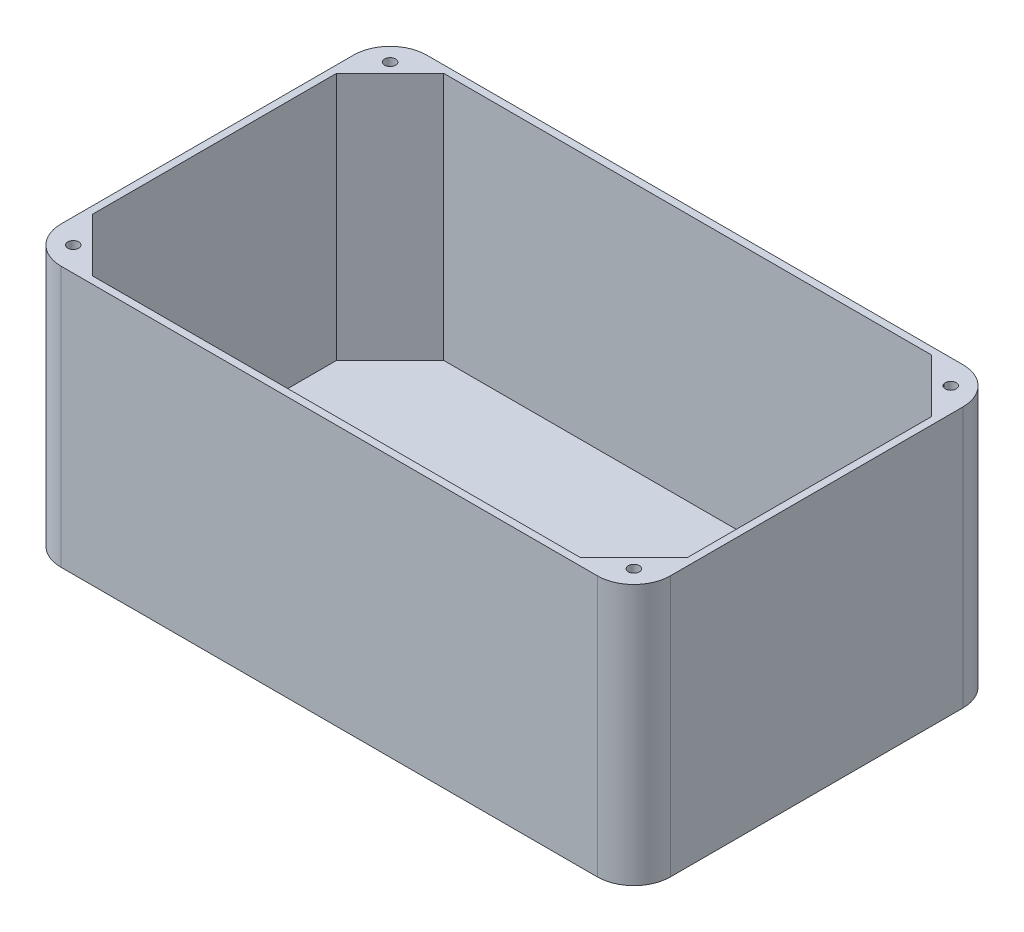
ISO-10303-21;
HEADER;
FILE_DESCRIPTION(('STEP AP214'),'2;1');
FILE_NAME('part.step','',(''),(''),'','','');
FILE_SCHEMA(('AUTOMOTIVE_DESIGN { 1 0 10303 214 1 1 1 1 }'));
ENDSEC;
DATA;
#1=APPLICATION_CONTEXT('core data for automotive mechanical design processes');
#2=APPLICATION_PROTOCOL_DEFINITION('international standard','automotive_design',2000,#1);
#3=PRODUCT_CONTEXT('',#1,'mechanical');
#4=PRODUCT('Part','Part','',(#3));
#5=PRODUCT_RELATED_PRODUCT_CATEGORY('part','',(#4));
#6=PRODUCT_DEFINITION_FORMATION('','',#4);
#7=PRODUCT_DEFINITION_CONTEXT('part definition',#1,'design');
#8=PRODUCT_DEFINITION('design','',#6,#7);
#9=PRODUCT_DEFINITION_SHAPE('','',#8);
#10=(LENGTH_UNIT() NAMED_UNIT(*) SI_UNIT(.MILLI.,.METRE.));
#11=(NAMED_UNIT(*) PLANE_ANGLE_UNIT() SI_UNIT($,.RADIAN.));
#12=(NAMED_UNIT(*) SI_UNIT($,.STERADIAN.) SOLID_ANGLE_UNIT());
#13=UNCERTAINTY_MEASURE_WITH_UNIT(LENGTH_MEASURE(1.E-05),#10,'distance_accuracy_value','');
#14=(GEOMETRIC_REPRESENTATION_CONTEXT(3) GLOBAL_UNCERTAINTY_ASSIGNED_CONTEXT((#13)) GLOBAL_UNIT_ASSIGNED_CONTEXT((#10,
#11,#12)) REPRESENTATION_CONTEXT('',''));
#15=CARTESIAN_POINT('',(0.,0.,0.));
#16=DIRECTION('',(0.,0.,1.));
#17=DIRECTION('',(1.,0.,0.));
#18=AXIS2_PLACEMENT_3D('',#15,#16,#17);
#19=CARTESIAN_POINT('',(-125.,110.,-72.));
#20=DIRECTION('',(0.,0.,1.));
#21=DIRECTION('',(1.,0.,0.));
#22=AXIS2_PLACEMENT_3D('',#19,#20,#21);
#23=PLANE('',#22);
#24=DIRECTION('',(-1.,0.,0.));
#25=VECTOR('',#24,1.);
#26=CARTESIAN_POINT('',(-125.,5.,-72.));
#27=LINE('',#26,#25);
#28=CARTESIAN_POINT('',(100.,5.,-72.));
#29=VERTEX_POINT('',#28);
#30=CARTESIAN_POINT('',(-100.,5.,-72.));
#31=VERTEX_POINT('',#30);
#32=EDGE_CURVE('E309',#29,#31,#27,.T.);
#33=ORIENTED_EDGE('',*,*,#32,.F.);
#34=DIRECTION('',(0.,1.,0.));
#35=VECTOR('',#34,1.);
#36=CARTESIAN_POINT('',(100.,110.,-72.));
#37=LINE('',#36,#35);
#38=CARTESIAN_POINT('',(100.,107.,-72.));
#39=VERTEX_POINT('',#38);
#40=EDGE_CURVE('E247',#29,#39,#37,.T.);
#41=ORIENTED_EDGE('',*,*,#40,.T.);
#42=DIRECTION('',(-1.,0.,0.));
#43=VECTOR('',#42,1.);
#44=CARTESIAN_POINT('',(0.,107.,-72.));
#45=LINE('',#44,#43);
#46=CARTESIAN_POINT('',(-100.,107.,-72.));
#47=VERTEX_POINT('',#46);
#48=EDGE_CURVE('E320',#39,#47,#45,.T.);
#49=ORIENTED_EDGE('',*,*,#48,.T.);
#50=DIRECTION('',(0.,1.,0.));
#51=VECTOR('',#50,1.);
#52=CARTESIAN_POINT('',(-100.,110.,-72.));
#53=LINE('',#52,#51);
#54=EDGE_CURVE('E279',#31,#47,#53,.T.);
#55=ORIENTED_EDGE('',*,*,#54,.F.);
#56=EDGE_LOOP('',(#33,#41,#49,#55));
#57=FACE_BOUND('',#56,.T.);
#58=ADVANCED_FACE('F74',(#57),#23,.T.);
#59=CARTESIAN_POINT('',(122.,110.,75.));
#60=DIRECTION('',(-1.,0.,0.));
#61=DIRECTION('',(0.,0.,1.));
#62=AXIS2_PLACEMENT_3D('',#59,#60,#61);
#63=PLANE('',#62);
#64=DIRECTION('',(0.,0.,-1.));
#65=VECTOR('',#64,1.);
#66=CARTESIAN_POINT('',(122.,107.,0.));
#67=LINE('',#66,#65);
#68=CARTESIAN_POINT('',(122.,107.,50.0000000000001));
#69=VERTEX_POINT('',#68);
#70=CARTESIAN_POINT('',(122.,107.,-50.0000000000001));
#71=VERTEX_POINT('',#70);
#72=EDGE_CURVE('E316',#69,#71,#67,.T.);
#73=ORIENTED_EDGE('',*,*,#72,.T.);
#74=DIRECTION('',(0.,-1.,0.));
#75=VECTOR('',#74,1.);
#76=CARTESIAN_POINT('',(122.,110.,-50.0000000000001));
#77=LINE('',#76,#75);
#78=CARTESIAN_POINT('',(122.,5.,-50.0000000000001));
#79=VERTEX_POINT('',#78);
#80=EDGE_CURVE('E243',#71,#79,#77,.T.);
#81=ORIENTED_EDGE('',*,*,#80,.T.);
#82=DIRECTION('',(0.,0.,-1.));
#83=VECTOR('',#82,1.);
#84=CARTESIAN_POINT('',(122.,5.,75.));
#85=LINE('',#84,#83);
#86=CARTESIAN_POINT('',(122.,5.,50.0000000000001));
#87=VERTEX_POINT('',#86);
#88=EDGE_CURVE('E312',#87,#79,#85,.T.);
#89=ORIENTED_EDGE('',*,*,#88,.F.);
#90=DIRECTION('',(0.,-1.,0.));
#91=VECTOR('',#90,1.);
#92=CARTESIAN_POINT('',(122.,110.,50.0000000000001));
#93=LINE('',#92,#91);
#94=EDGE_CURVE('E267',#69,#87,#93,.T.);
#95=ORIENTED_EDGE('',*,*,#94,.F.);
#96=EDGE_LOOP('',(#73,#81,#89,#95));
#97=FACE_BOUND('',#96,.T.);
#98=ADVANCED_FACE('F445',(#97),#63,.T.);
#99=CARTESIAN_POINT('',(0.,5.,0.));
#100=DIRECTION('',(0.,1.,0.));
#101=DIRECTION('',(0.,0.,1.));
#102=AXIS2_PLACEMENT_3D('',#99,#100,#101);
#103=PLANE('',#102);
#104=ORIENTED_EDGE('',*,*,#88,.T.);
#105=DIRECTION('',(-0.707106781186548,0.,-0.707106781186547));
#106=VECTOR('',#105,1.);
#107=CARTESIAN_POINT('',(86.,5.,-86.));
#108=LINE('',#107,#106);
#109=EDGE_CURVE('E356',#79,#29,#108,.T.);
#110=ORIENTED_EDGE('',*,*,#109,.T.);
#111=ORIENTED_EDGE('',*,*,#32,.T.);
#112=DIRECTION('',(0.707106781186547,0.,-0.707106781186548));
#113=VECTOR('',#112,1.);
#114=CARTESIAN_POINT('',(-86.0000000000001,5.,-86.));
#115=LINE('',#114,#113);
#116=CARTESIAN_POINT('',(-122.,5.,-50.));
#117=VERTEX_POINT('',#116);
#118=EDGE_CURVE('E344',#117,#31,#115,.T.);
#119=ORIENTED_EDGE('',*,*,#118,.F.);
#120=DIRECTION('',(0.,0.,1.));
#121=VECTOR('',#120,1.);
#122=CARTESIAN_POINT('',(-122.,5.,75.));
#123=LINE('',#122,#121);
#124=CARTESIAN_POINT('',(-122.,5.,50.));
#125=VERTEX_POINT('',#124);
#126=EDGE_CURVE('E306',#117,#125,#123,.T.);
#127=ORIENTED_EDGE('',*,*,#126,.T.);
#128=DIRECTION('',(-0.707106781186542,0.,-0.707106781186553));
#129=VECTOR('',#128,1.);
#130=CARTESIAN_POINT('',(-86.000000000001,5.,85.9999999999996));
#131=LINE('',#130,#129);
#132=CARTESIAN_POINT('',(-100.,5.,72.));
#133=VERTEX_POINT('',#132);
#134=EDGE_CURVE('E352',#133,#125,#131,.T.);
#135=ORIENTED_EDGE('',*,*,#134,.F.);
#136=DIRECTION('',(1.,0.,0.));
#137=VECTOR('',#136,1.);
#138=CARTESIAN_POINT('',(-125.,5.,72.));
#139=LINE('',#138,#137);
#140=CARTESIAN_POINT('',(100.,5.,72.));
#141=VERTEX_POINT('',#140);
#142=EDGE_CURVE('E303',#133,#141,#139,.T.);
#143=ORIENTED_EDGE('',*,*,#142,.T.);
#144=DIRECTION('',(-0.707106781186548,0.,0.707106781186547));
#145=VECTOR('',#144,1.);
#146=CARTESIAN_POINT('',(86.,5.,86.));
#147=LINE('',#146,#145);
#148=EDGE_CURVE('E348',#87,#141,#147,.T.);
#149=ORIENTED_EDGE('',*,*,#148,.F.);
#150=EDGE_LOOP('',(#104,#110,#111,#119,#127,#135,#143,#149));
#151=FACE_BOUND('',#150,.T.);
#152=ADVANCED_FACE('F451',(#151),#103,.T.);
#153=CARTESIAN_POINT('',(0.,0.,0.));
#154=DIRECTION('',(0.,-1.,0.));
#155=DIRECTION('',(0.,0.,-1.));
#156=AXIS2_PLACEMENT_3D('',#153,#154,#155);
#157=PLANE('',#156);
#158=DIRECTION('',(-1.,0.,0.));
#159=VECTOR('',#158,1.);
#160=CARTESIAN_POINT('',(-125.,0.,-75.));
#161=LINE('',#160,#159);
#162=CARTESIAN_POINT('',(110.,0.,-75.));
#163=VERTEX_POINT('',#162);
#164=CARTESIAN_POINT('',(-110.,0.,-75.));
#165=VERTEX_POINT('',#164);
#166=EDGE_CURVE('E333',#163,#165,#161,.T.);
#167=ORIENTED_EDGE('',*,*,#166,.F.);
#168=CARTESIAN_POINT('',(110.,0.,-60.));
#169=DIRECTION('',(0.,-1.,0.));
#170=DIRECTION('',(0.,0.,-1.));
#171=AXIS2_PLACEMENT_3D('',#168,#169,#170);
#172=CIRCLE('',#171,15.);
#173=CARTESIAN_POINT('',(125.,0.,-60.));
#174=VERTEX_POINT('',#173);
#175=EDGE_CURVE('E394',#163,#174,#172,.T.);
#176=ORIENTED_EDGE('',*,*,#175,.T.);
#177=DIRECTION('',(0.,0.,-1.));
#178=VECTOR('',#177,1.);
#179=CARTESIAN_POINT('',(125.,0.,75.));
#180=LINE('',#179,#178);
#181=CARTESIAN_POINT('',(125.,0.,60.));
#182=VERTEX_POINT('',#181);
#183=EDGE_CURVE('E329',#182,#174,#180,.T.);
#184=ORIENTED_EDGE('',*,*,#183,.F.);
#185=CARTESIAN_POINT('',(110.,0.,60.));
#186=DIRECTION('',(0.,-1.,0.));
#187=DIRECTION('',(0.,0.,-1.));
#188=AXIS2_PLACEMENT_3D('',#185,#186,#187);
#189=CIRCLE('',#188,15.);
#190=CARTESIAN_POINT('',(110.,0.,75.));
#191=VERTEX_POINT('',#190);
#192=EDGE_CURVE('E391',#182,#191,#189,.T.);
#193=ORIENTED_EDGE('',*,*,#192,.T.);
#194=DIRECTION('',(1.,0.,0.));
#195=VECTOR('',#194,1.);
#196=CARTESIAN_POINT('',(-125.,0.,75.));
#197=LINE('',#196,#195);
#198=CARTESIAN_POINT('',(-110.,0.,75.));
#199=VERTEX_POINT('',#198);
#200=EDGE_CURVE('E340',#199,#191,#197,.T.);
#201=ORIENTED_EDGE('',*,*,#200,.F.);
#202=CARTESIAN_POINT('',(-110.,0.,60.));
#203=DIRECTION('',(0.,-1.,0.));
#204=DIRECTION('',(0.,0.,-1.));
#205=AXIS2_PLACEMENT_3D('',#202,#203,#204);
#206=CIRCLE('',#205,15.);
#207=CARTESIAN_POINT('',(-125.,0.,60.));
#208=VERTEX_POINT('',#207);
#209=EDGE_CURVE('E90',#199,#208,#206,.T.);
#210=ORIENTED_EDGE('',*,*,#209,.T.);
#211=DIRECTION('',(0.,0.,1.));
#212=VECTOR('',#211,1.);
#213=CARTESIAN_POINT('',(-125.,0.,75.));
#214=LINE('',#213,#212);
#215=CARTESIAN_POINT('',(-125.,0.,-60.));
#216=VERTEX_POINT('',#215);
#217=EDGE_CURVE('E337',#216,#208,#214,.T.);
#218=ORIENTED_EDGE('',*,*,#217,.F.);
#219=CARTESIAN_POINT('',(-110.,0.,-60.));
#220=DIRECTION('',(0.,-1.,0.));
#221=DIRECTION('',(0.,0.,-1.));
#222=AXIS2_PLACEMENT_3D('',#219,#220,#221);
#223=CIRCLE('',#222,15.);
#224=EDGE_CURVE('E386',#216,#165,#223,.T.);
#225=ORIENTED_EDGE('',*,*,#224,.T.);
#226=EDGE_LOOP('',(#167,#176,#184,#193,#201,#210,#218,#225));
#227=FACE_BOUND('',#226,.T.);
#228=ADVANCED_FACE('F420',(#227),#157,.T.);
#229=CARTESIAN_POINT('',(125.,110.,75.));
#230=DIRECTION('',(-1.,0.,0.));
#231=DIRECTION('',(0.,0.,1.));
#232=AXIS2_PLACEMENT_3D('',#229,#230,#231);
#233=PLANE('',#232);
#234=ORIENTED_EDGE('',*,*,#183,.T.);
#235=DIRECTION('',(0.,1.,0.));
#236=VECTOR('',#235,1.);
#237=CARTESIAN_POINT('',(125.,110.,-60.));
#238=LINE('',#237,#236);
#239=CARTESIAN_POINT('',(125.,107.,-60.));
#240=VERTEX_POINT('',#239);
#241=EDGE_CURVE('E363',#174,#240,#238,.T.);
#242=ORIENTED_EDGE('',*,*,#241,.T.);
#243=DIRECTION('',(0.,0.,-1.));
#244=VECTOR('',#243,1.);
#245=CARTESIAN_POINT('',(125.,107.,75.));
#246=LINE('',#245,#244);
#247=CARTESIAN_POINT('',(125.,107.,60.));
#248=VERTEX_POINT('',#247);
#249=EDGE_CURVE('E287',#248,#240,#246,.T.);
#250=ORIENTED_EDGE('',*,*,#249,.F.);
#251=DIRECTION('',(0.,1.,0.));
#252=VECTOR('',#251,1.);
#253=CARTESIAN_POINT('',(125.,110.,60.));
#254=LINE('',#253,#252);
#255=EDGE_CURVE('E360',#248,#182,#254,.F.);
#256=ORIENTED_EDGE('',*,*,#255,.T.);
#257=EDGE_LOOP('',(#234,#242,#250,#256));
#258=FACE_BOUND('',#257,.T.);
#259=ADVANCED_FACE('F432',(#258),#233,.F.);
#260=CARTESIAN_POINT('',(-125.,110.,-75.));
#261=DIRECTION('',(0.,0.,1.));
#262=DIRECTION('',(1.,0.,0.));
#263=AXIS2_PLACEMENT_3D('',#260,#261,#262);
#264=PLANE('',#263);
#265=DIRECTION('',(-1.,0.,0.));
#266=VECTOR('',#265,1.);
#267=CARTESIAN_POINT('',(-125.,107.,-75.));
#268=LINE('',#267,#266);
#269=CARTESIAN_POINT('',(110.,107.,-75.));
#270=VERTEX_POINT('',#269);
#271=CARTESIAN_POINT('',(-110.,107.,-75.));
#272=VERTEX_POINT('',#271);
#273=EDGE_CURVE('E291',#270,#272,#268,.T.);
#274=ORIENTED_EDGE('',*,*,#273,.F.);
#275=DIRECTION('',(0.,1.,0.));
#276=VECTOR('',#275,1.);
#277=CARTESIAN_POINT('',(110.,110.,-75.));
#278=LINE('',#277,#276);
#279=EDGE_CURVE('E383',#270,#163,#278,.F.);
#280=ORIENTED_EDGE('',*,*,#279,.T.);
#281=ORIENTED_EDGE('',*,*,#166,.T.);
#282=DIRECTION('',(0.,1.,0.));
#283=VECTOR('',#282,1.);
#284=CARTESIAN_POINT('',(-110.,110.,-75.));
#285=LINE('',#284,#283);
#286=EDGE_CURVE('E379',#165,#272,#285,.T.);
#287=ORIENTED_EDGE('',*,*,#286,.T.);
#288=EDGE_LOOP('',(#274,#280,#281,#287));
#289=FACE_BOUND('',#288,.T.);
#290=ADVANCED_FACE('F425',(#289),#264,.F.);
#291=CARTESIAN_POINT('',(-125.,110.,75.));
#292=DIRECTION('',(1.,0.,0.));
#293=DIRECTION('',(0.,0.,-1.));
#294=AXIS2_PLACEMENT_3D('',#291,#292,#293);
#295=PLANE('',#294);
#296=ORIENTED_EDGE('',*,*,#217,.T.);
#297=DIRECTION('',(0.,1.,0.));
#298=VECTOR('',#297,1.);
#299=CARTESIAN_POINT('',(-125.,110.,60.));
#300=LINE('',#299,#298);
#301=CARTESIAN_POINT('',(-125.,107.,60.));
#302=VERTEX_POINT('',#301);
#303=EDGE_CURVE('E12',#208,#302,#300,.T.);
#304=ORIENTED_EDGE('',*,*,#303,.T.);
#305=DIRECTION('',(0.,0.,1.));
#306=VECTOR('',#305,1.);
#307=CARTESIAN_POINT('',(-125.,107.,75.));
#308=LINE('',#307,#306);
#309=CARTESIAN_POINT('',(-125.,107.,-60.));
#310=VERTEX_POINT('',#309);
#311=EDGE_CURVE('E295',#310,#302,#308,.T.);
#312=ORIENTED_EDGE('',*,*,#311,.F.);
#313=DIRECTION('',(0.,1.,0.));
#314=VECTOR('',#313,1.);
#315=CARTESIAN_POINT('',(-125.,110.,-60.));
#316=LINE('',#315,#314);
#317=EDGE_CURVE('E83',#310,#216,#316,.F.);
#318=ORIENTED_EDGE('',*,*,#317,.T.);
#319=EDGE_LOOP('',(#296,#304,#312,#318));
#320=FACE_BOUND('',#319,.T.);
#321=ADVANCED_FACE('F417',(#320),#295,.F.);
#322=CARTESIAN_POINT('',(-125.,110.,75.));
#323=DIRECTION('',(0.,0.,-1.));
#324=DIRECTION('',(-1.,0.,0.));
#325=AXIS2_PLACEMENT_3D('',#322,#323,#324);
#326=PLANE('',#325);
#327=ORIENTED_EDGE('',*,*,#200,.T.);
#328=DIRECTION('',(0.,1.,0.));
#329=VECTOR('',#328,1.);
#330=CARTESIAN_POINT('',(110.,110.,75.));
#331=LINE('',#330,#329);
#332=CARTESIAN_POINT('',(110.,107.,75.));
#333=VERTEX_POINT('',#332);
#334=EDGE_CURVE('E400',#191,#333,#331,.T.);
#335=ORIENTED_EDGE('',*,*,#334,.T.);
#336=DIRECTION('',(1.,0.,0.));
#337=VECTOR('',#336,1.);
#338=CARTESIAN_POINT('',(-125.,107.,75.));
#339=LINE('',#338,#337);
#340=CARTESIAN_POINT('',(-110.,107.,75.));
#341=VERTEX_POINT('',#340);
#342=EDGE_CURVE('E299',#341,#333,#339,.T.);
#343=ORIENTED_EDGE('',*,*,#342,.F.);
#344=DIRECTION('',(0.,1.,0.));
#345=VECTOR('',#344,1.);
#346=CARTESIAN_POINT('',(-110.,110.,75.));
#347=LINE('',#346,#345);
#348=EDGE_CURVE('E397',#341,#199,#347,.F.);
#349=ORIENTED_EDGE('',*,*,#348,.T.);
#350=EDGE_LOOP('',(#327,#335,#343,#349));
#351=FACE_BOUND('',#350,.T.);
#352=ADVANCED_FACE('F407',(#351),#326,.F.);
#353=CARTESIAN_POINT('',(0.,107.,0.));
#354=DIRECTION('',(0.,-1.,0.));
#355=DIRECTION('',(0.,0.,-1.));
#356=AXIS2_PLACEMENT_3D('',#353,#354,#355);
#357=PLANE('',#356);
#358=CARTESIAN_POINT('',(-115.,107.,-65.));
#359=DIRECTION('',(0.,1.,0.));
#360=DIRECTION('',(0.,0.,1.));
#361=AXIS2_PLACEMENT_3D('',#358,#359,#360);
#362=CIRCLE('',#361,2.25);
#363=CARTESIAN_POINT('',(-115.,107.,-62.75));
#364=VERTEX_POINT('',#363);
#365=EDGE_CURVE('E211',#364,#364,#362,.T.);
#366=ORIENTED_EDGE('',*,*,#365,.F.);
#367=EDGE_LOOP('',(#366));
#368=FACE_BOUND('',#367,.T.);
#369=CARTESIAN_POINT('',(115.,107.,-65.));
#370=DIRECTION('',(0.,1.,0.));
#371=DIRECTION('',(0.,0.,1.));
#372=AXIS2_PLACEMENT_3D('',#369,#370,#371);
#373=CIRCLE('',#372,2.25);
#374=CARTESIAN_POINT('',(115.,107.,-62.75));
#375=VERTEX_POINT('',#374);
#376=EDGE_CURVE('E210',#375,#375,#373,.T.);
#377=ORIENTED_EDGE('',*,*,#376,.F.);
#378=EDGE_LOOP('',(#377));
#379=FACE_BOUND('',#378,.T.);
#380=CARTESIAN_POINT('',(115.,107.,65.));
#381=DIRECTION('',(0.,1.,0.));
#382=DIRECTION('',(0.,0.,1.));
#383=AXIS2_PLACEMENT_3D('',#380,#381,#382);
#384=CIRCLE('',#383,2.25);
#385=CARTESIAN_POINT('',(115.,107.,67.25));
#386=VERTEX_POINT('',#385);
#387=EDGE_CURVE('E224',#386,#386,#384,.T.);
#388=ORIENTED_EDGE('',*,*,#387,.F.);
#389=EDGE_LOOP('',(#388));
#390=FACE_BOUND('',#389,.T.);
#391=CARTESIAN_POINT('',(-115.,107.,65.));
#392=DIRECTION('',(0.,1.,0.));
#393=DIRECTION('',(0.,0.,1.));
#394=AXIS2_PLACEMENT_3D('',#391,#392,#393);
#395=CIRCLE('',#394,2.25);
#396=CARTESIAN_POINT('',(-115.,107.,67.25));
#397=VERTEX_POINT('',#396);
#398=EDGE_CURVE('E232',#397,#397,#395,.T.);
#399=ORIENTED_EDGE('',*,*,#398,.F.);
#400=EDGE_LOOP('',(#399));
#401=FACE_BOUND('',#400,.T.);
#402=ORIENTED_EDGE('',*,*,#48,.F.);
#403=DIRECTION('',(-0.707106781186548,0.,-0.707106781186547));
#404=VECTOR('',#403,1.);
#405=CARTESIAN_POINT('',(122.,107.,-50.));
#406=LINE('',#405,#404);
#407=EDGE_CURVE('E240',#71,#39,#406,.T.);
#408=ORIENTED_EDGE('',*,*,#407,.F.);
#409=ORIENTED_EDGE('',*,*,#72,.F.);
#410=DIRECTION('',(-0.707106781186548,0.,0.707106781186547));
#411=VECTOR('',#410,1.);
#412=CARTESIAN_POINT('',(86.,107.,86.));
#413=LINE('',#412,#411);
#414=CARTESIAN_POINT('',(100.,107.,72.));
#415=VERTEX_POINT('',#414);
#416=EDGE_CURVE('E263',#69,#415,#413,.T.);
#417=ORIENTED_EDGE('',*,*,#416,.T.);
#418=DIRECTION('',(1.,0.,0.));
#419=VECTOR('',#418,1.);
#420=CARTESIAN_POINT('',(0.,107.,72.));
#421=LINE('',#420,#419);
#422=CARTESIAN_POINT('',(-100.,107.,72.));
#423=VERTEX_POINT('',#422);
#424=EDGE_CURVE('E326',#423,#415,#421,.T.);
#425=ORIENTED_EDGE('',*,*,#424,.F.);
#426=DIRECTION('',(-0.707106781186542,0.,-0.707106781186553));
#427=VECTOR('',#426,1.);
#428=CARTESIAN_POINT('',(-122.,107.,50.));
#429=LINE('',#428,#427);
#430=CARTESIAN_POINT('',(-122.,107.,50.));
#431=VERTEX_POINT('',#430);
#432=EDGE_CURVE('E251',#423,#431,#429,.T.);
#433=ORIENTED_EDGE('',*,*,#432,.T.);
#434=DIRECTION('',(0.,0.,1.));
#435=VECTOR('',#434,1.);
#436=CARTESIAN_POINT('',(-122.,107.,0.));
#437=LINE('',#436,#435);
#438=CARTESIAN_POINT('',(-122.,107.,-50.));
#439=VERTEX_POINT('',#438);
#440=EDGE_CURVE('E323',#439,#431,#437,.T.);
#441=ORIENTED_EDGE('',*,*,#440,.F.);
#442=DIRECTION('',(0.707106781186547,0.,-0.707106781186548));
#443=VECTOR('',#442,1.);
#444=CARTESIAN_POINT('',(-86.,107.,-86.));
#445=LINE('',#444,#443);
#446=EDGE_CURVE('E275',#439,#47,#445,.T.);
#447=ORIENTED_EDGE('',*,*,#446,.T.);
#448=EDGE_LOOP('',(#402,#408,#409,#417,#425,#433,#441,#447));
#449=FACE_BOUND('',#448,.T.);
#450=ORIENTED_EDGE('',*,*,#249,.T.);
#451=CARTESIAN_POINT('',(110.,107.,-60.));
#452=DIRECTION('',(0.,-1.,0.));
#453=DIRECTION('',(0.,0.,-1.));
#454=AXIS2_PLACEMENT_3D('',#451,#452,#453);
#455=CIRCLE('',#454,15.);
#456=EDGE_CURVE('E376',#240,#270,#455,.F.);
#457=ORIENTED_EDGE('',*,*,#456,.T.);
#458=ORIENTED_EDGE('',*,*,#273,.T.);
#459=CARTESIAN_POINT('',(-110.,107.,-60.));
#460=DIRECTION('',(0.,-1.,0.));
#461=DIRECTION('',(0.,0.,-1.));
#462=AXIS2_PLACEMENT_3D('',#459,#460,#461);
#463=CIRCLE('',#462,15.);
#464=EDGE_CURVE('E367',#272,#310,#463,.F.);
#465=ORIENTED_EDGE('',*,*,#464,.T.);
#466=ORIENTED_EDGE('',*,*,#311,.T.);
#467=CARTESIAN_POINT('',(-110.,107.,60.));
#468=DIRECTION('',(0.,-1.,0.));
#469=DIRECTION('',(0.,0.,-1.));
#470=AXIS2_PLACEMENT_3D('',#467,#468,#469);
#471=CIRCLE('',#470,15.);
#472=EDGE_CURVE('E370',#302,#341,#471,.F.);
#473=ORIENTED_EDGE('',*,*,#472,.T.);
#474=ORIENTED_EDGE('',*,*,#342,.T.);
#475=CARTESIAN_POINT('',(110.,107.,60.));
#476=DIRECTION('',(0.,-1.,0.));
#477=DIRECTION('',(0.,0.,-1.));
#478=AXIS2_PLACEMENT_3D('',#475,#476,#477);
#479=CIRCLE('',#478,15.);
#480=EDGE_CURVE('E373',#333,#248,#479,.F.);
#481=ORIENTED_EDGE('',*,*,#480,.T.);
#482=EDGE_LOOP('',(#450,#457,#458,#465,#466,#473,#474,#481));
#483=FACE_BOUND('',#482,.T.);
#484=ADVANCED_FACE('F412',(#368,#379,#390,#401,#449,#483),#357,.F.);
#485=CARTESIAN_POINT('',(-125.,110.,72.));
#486=DIRECTION('',(0.,0.,-1.));
#487=DIRECTION('',(-1.,0.,0.));
#488=AXIS2_PLACEMENT_3D('',#485,#486,#487);
#489=PLANE('',#488);
#490=DIRECTION('',(0.,-1.,0.));
#491=VECTOR('',#490,1.);
#492=CARTESIAN_POINT('',(-100.,110.,72.));
#493=LINE('',#492,#491);
#494=EDGE_CURVE('E259',#423,#133,#493,.T.);
#495=ORIENTED_EDGE('',*,*,#494,.F.);
#496=ORIENTED_EDGE('',*,*,#424,.T.);
#497=DIRECTION('',(0.,1.,0.));
#498=VECTOR('',#497,1.);
#499=CARTESIAN_POINT('',(100.,110.,72.));
#500=LINE('',#499,#498);
#501=EDGE_CURVE('E271',#141,#415,#500,.T.);
#502=ORIENTED_EDGE('',*,*,#501,.F.);
#503=ORIENTED_EDGE('',*,*,#142,.F.);
#504=EDGE_LOOP('',(#495,#496,#502,#503));
#505=FACE_BOUND('',#504,.T.);
#506=ADVANCED_FACE('F461',(#505),#489,.T.);
#507=CARTESIAN_POINT('',(-122.,110.,75.));
#508=DIRECTION('',(1.,0.,0.));
#509=DIRECTION('',(0.,0.,-1.));
#510=AXIS2_PLACEMENT_3D('',#507,#508,#509);
#511=PLANE('',#510);
#512=DIRECTION('',(0.,1.,0.));
#513=VECTOR('',#512,1.);
#514=CARTESIAN_POINT('',(-122.,110.,50.));
#515=LINE('',#514,#513);
#516=EDGE_CURVE('E255',#125,#431,#515,.T.);
#517=ORIENTED_EDGE('',*,*,#516,.F.);
#518=ORIENTED_EDGE('',*,*,#126,.F.);
#519=DIRECTION('',(0.,-1.,0.));
#520=VECTOR('',#519,1.);
#521=CARTESIAN_POINT('',(-122.,110.,-50.));
#522=LINE('',#521,#520);
#523=EDGE_CURVE('E283',#439,#117,#522,.T.);
#524=ORIENTED_EDGE('',*,*,#523,.F.);
#525=ORIENTED_EDGE('',*,*,#440,.T.);
#526=EDGE_LOOP('',(#517,#518,#524,#525));
#527=FACE_BOUND('',#526,.T.);
#528=ADVANCED_FACE('F457',(#527),#511,.T.);
#529=CARTESIAN_POINT('',(-86.,-39.5979797464466,-86.));
#530=DIRECTION('',(0.707106781186548,0.,0.707106781186547));
#531=DIRECTION('',(0.707106781186547,0.,-0.707106781186548));
#532=AXIS2_PLACEMENT_3D('',#529,#530,#531);
#533=PLANE('',#532);
#534=ORIENTED_EDGE('',*,*,#446,.F.);
#535=ORIENTED_EDGE('',*,*,#523,.T.);
#536=ORIENTED_EDGE('',*,*,#118,.T.);
#537=ORIENTED_EDGE('',*,*,#54,.T.);
#538=EDGE_LOOP('',(#534,#535,#536,#537));
#539=FACE_BOUND('',#538,.T.);
#540=ADVANCED_FACE('F460',(#539),#533,.T.);
#541=CARTESIAN_POINT('',(86.,-39.5979797464466,86.));
#542=DIRECTION('',(-0.707106781186547,0.,-0.707106781186548));
#543=DIRECTION('',(-0.707106781186548,0.,0.707106781186547));
#544=AXIS2_PLACEMENT_3D('',#541,#542,#543);
#545=PLANE('',#544);
#546=ORIENTED_EDGE('',*,*,#148,.T.);
#547=ORIENTED_EDGE('',*,*,#501,.T.);
#548=ORIENTED_EDGE('',*,*,#416,.F.);
#549=ORIENTED_EDGE('',*,*,#94,.T.);
#550=EDGE_LOOP('',(#546,#547,#548,#549));
#551=FACE_BOUND('',#550,.T.);
#552=ADVANCED_FACE('F611',(#551),#545,.T.);
#553=CARTESIAN_POINT('',(-122.,-39.5979797464466,50.));
#554=DIRECTION('',(0.707106781186553,0.,-0.707106781186542));
#555=DIRECTION('',(-0.707106781186542,0.,-0.707106781186553));
#556=AXIS2_PLACEMENT_3D('',#553,#554,#555);
#557=PLANE('',#556);
#558=ORIENTED_EDGE('',*,*,#432,.F.);
#559=ORIENTED_EDGE('',*,*,#494,.T.);
#560=ORIENTED_EDGE('',*,*,#134,.T.);
#561=ORIENTED_EDGE('',*,*,#516,.T.);
#562=EDGE_LOOP('',(#558,#559,#560,#561));
#563=FACE_BOUND('',#562,.T.);
#564=ADVANCED_FACE('F607',(#563),#557,.T.);
#565=CARTESIAN_POINT('',(86.,-39.5979797464466,-86.));
#566=DIRECTION('',(0.707106781186547,0.,-0.707106781186548));
#567=DIRECTION('',(-0.707106781186548,0.,-0.707106781186547));
#568=AXIS2_PLACEMENT_3D('',#565,#566,#567);
#569=PLANE('',#568);
#570=ORIENTED_EDGE('',*,*,#40,.F.);
#571=ORIENTED_EDGE('',*,*,#109,.F.);
#572=ORIENTED_EDGE('',*,*,#80,.F.);
#573=ORIENTED_EDGE('',*,*,#407,.T.);
#574=EDGE_LOOP('',(#570,#571,#572,#573));
#575=FACE_BOUND('',#574,.T.);
#576=ADVANCED_FACE('F442',(#575),#569,.F.);
#577=CARTESIAN_POINT('',(110.,110.,-60.));
#578=DIRECTION('',(0.,1.,0.));
#579=DIRECTION('',(0.,0.,1.));
#580=AXIS2_PLACEMENT_3D('',#577,#578,#579);
#581=CYLINDRICAL_SURFACE('',#580,15.);
#582=ORIENTED_EDGE('',*,*,#175,.F.);
#583=ORIENTED_EDGE('',*,*,#279,.F.);
#584=ORIENTED_EDGE('',*,*,#456,.F.);
#585=ORIENTED_EDGE('',*,*,#241,.F.);
#586=EDGE_LOOP('',(#582,#583,#584,#585));
#587=FACE_BOUND('',#586,.T.);
#588=ADVANCED_FACE('F430',(#587),#581,.T.);
#589=CARTESIAN_POINT('',(110.,110.,60.));
#590=DIRECTION('',(0.,1.,0.));
#591=DIRECTION('',(0.,0.,1.));
#592=AXIS2_PLACEMENT_3D('',#589,#590,#591);
#593=CYLINDRICAL_SURFACE('',#592,15.);
#594=ORIENTED_EDGE('',*,*,#192,.F.);
#595=ORIENTED_EDGE('',*,*,#255,.F.);
#596=ORIENTED_EDGE('',*,*,#480,.F.);
#597=ORIENTED_EDGE('',*,*,#334,.F.);
#598=EDGE_LOOP('',(#594,#595,#596,#597));
#599=FACE_BOUND('',#598,.T.);
#600=ADVANCED_FACE('F435',(#599),#593,.T.);
#601=CARTESIAN_POINT('',(-110.,110.,60.));
#602=DIRECTION('',(0.,1.,0.));
#603=DIRECTION('',(0.,0.,1.));
#604=AXIS2_PLACEMENT_3D('',#601,#602,#603);
#605=CYLINDRICAL_SURFACE('',#604,15.);
#606=ORIENTED_EDGE('',*,*,#209,.F.);
#607=ORIENTED_EDGE('',*,*,#348,.F.);
#608=ORIENTED_EDGE('',*,*,#472,.F.);
#609=ORIENTED_EDGE('',*,*,#303,.F.);
#610=EDGE_LOOP('',(#606,#607,#608,#609));
#611=FACE_BOUND('',#610,.T.);
#612=ADVANCED_FACE('F416',(#611),#605,.T.);
#613=CARTESIAN_POINT('',(-110.,110.,-60.));
#614=DIRECTION('',(0.,1.,0.));
#615=DIRECTION('',(0.,0.,1.));
#616=AXIS2_PLACEMENT_3D('',#613,#614,#615);
#617=CYLINDRICAL_SURFACE('',#616,15.);
#618=ORIENTED_EDGE('',*,*,#224,.F.);
#619=ORIENTED_EDGE('',*,*,#317,.F.);
#620=ORIENTED_EDGE('',*,*,#464,.F.);
#621=ORIENTED_EDGE('',*,*,#286,.F.);
#622=EDGE_LOOP('',(#618,#619,#620,#621));
#623=FACE_BOUND('',#622,.T.);
#624=ADVANCED_FACE('F76',(#623),#617,.T.);
#625=CARTESIAN_POINT('',(-115.,67.,65.));
#626=DIRECTION('',(0.,1.,0.));
#627=DIRECTION('',(0.,0.,1.));
#628=AXIS2_PLACEMENT_3D('',#625,#626,#627);
#629=CONICAL_SURFACE('',#628,2.24999999999999,1.02974425867665);
#630=CARTESIAN_POINT('',(-115.,65.648063607188,65.));
#631=VERTEX_POINT('',#630);
#632=VERTEX_LOOP('',#631);
#633=FACE_BOUND('',#632,.T.);
#634=CARTESIAN_POINT('',(-115.,67.,65.));
#635=DIRECTION('',(0.,1.,0.));
#636=DIRECTION('',(0.,0.,1.));
#637=AXIS2_PLACEMENT_3D('',#634,#635,#636);
#638=CIRCLE('',#637,2.24999999999999);
#639=CARTESIAN_POINT('',(-115.,67.,67.25));
#640=VERTEX_POINT('',#639);
#641=EDGE_CURVE('E236',#640,#640,#638,.T.);
#642=ORIENTED_EDGE('',*,*,#641,.T.);
#643=EDGE_LOOP('',(#642));
#644=FACE_BOUND('',#643,.T.);
#645=ADVANCED_FACE('F529',(#633,#644),#629,.F.);
#646=CARTESIAN_POINT('',(-115.,107.,65.));
#647=DIRECTION('',(0.,1.,0.));
#648=DIRECTION('',(0.,0.,1.));
#649=AXIS2_PLACEMENT_3D('',#646,#647,#648);
#650=CYLINDRICAL_SURFACE('',#649,2.25);
#651=ORIENTED_EDGE('',*,*,#641,.F.);
#652=EDGE_LOOP('',(#651));
#653=FACE_BOUND('',#652,.T.);
#654=ORIENTED_EDGE('',*,*,#398,.T.);
#655=EDGE_LOOP('',(#654));
#656=FACE_BOUND('',#655,.T.);
#657=ADVANCED_FACE('F538',(#653,#656),#650,.F.);
#658=CARTESIAN_POINT('',(115.,67.,65.));
#659=DIRECTION('',(0.,1.,0.));
#660=DIRECTION('',(0.,0.,1.));
#661=AXIS2_PLACEMENT_3D('',#658,#659,#660);
#662=CONICAL_SURFACE('',#661,2.24999999999999,1.02974425867665);
#663=CARTESIAN_POINT('',(115.,65.648063607188,65.));
#664=VERTEX_POINT('',#663);
#665=VERTEX_LOOP('',#664);
#666=FACE_BOUND('',#665,.T.);
#667=CARTESIAN_POINT('',(115.,67.,65.));
#668=DIRECTION('',(0.,1.,0.));
#669=DIRECTION('',(0.,0.,1.));
#670=AXIS2_PLACEMENT_3D('',#667,#668,#669);
#671=CIRCLE('',#670,2.24999999999999);
#672=CARTESIAN_POINT('',(115.,67.,67.25));
#673=VERTEX_POINT('',#672);
#674=EDGE_CURVE('E228',#673,#673,#671,.T.);
#675=ORIENTED_EDGE('',*,*,#674,.T.);
#676=EDGE_LOOP('',(#675));
#677=FACE_BOUND('',#676,.T.);
#678=ADVANCED_FACE('F548',(#666,#677),#662,.F.);
#679=CARTESIAN_POINT('',(115.,107.,65.));
#680=DIRECTION('',(0.,1.,0.));
#681=DIRECTION('',(0.,0.,1.));
#682=AXIS2_PLACEMENT_3D('',#679,#680,#681);
#683=CYLINDRICAL_SURFACE('',#682,2.25);
#684=ORIENTED_EDGE('',*,*,#674,.F.);
#685=EDGE_LOOP('',(#684));
#686=FACE_BOUND('',#685,.T.);
#687=ORIENTED_EDGE('',*,*,#387,.T.);
#688=EDGE_LOOP('',(#687));
#689=FACE_BOUND('',#688,.T.);
#690=ADVANCED_FACE('F558',(#686,#689),#683,.F.);
#691=CARTESIAN_POINT('',(115.,67.,-65.));
#692=DIRECTION('',(0.,1.,0.));
#693=DIRECTION('',(0.,0.,1.));
#694=AXIS2_PLACEMENT_3D('',#691,#692,#693);
#695=CONICAL_SURFACE('',#694,2.24999999999999,1.02974425867665);
#696=CARTESIAN_POINT('',(115.,65.648063607188,-65.));
#697=VERTEX_POINT('',#696);
#698=VERTEX_LOOP('',#697);
#699=FACE_BOUND('',#698,.T.);
#700=CARTESIAN_POINT('',(115.,67.,-65.));
#701=DIRECTION('',(0.,1.,0.));
#702=DIRECTION('',(0.,0.,1.));
#703=AXIS2_PLACEMENT_3D('',#700,#701,#702);
#704=CIRCLE('',#703,2.24999999999999);
#705=CARTESIAN_POINT('',(115.,67.,-62.75));
#706=VERTEX_POINT('',#705);
#707=EDGE_CURVE('E216',#706,#706,#704,.T.);
#708=ORIENTED_EDGE('',*,*,#707,.T.);
#709=EDGE_LOOP('',(#708));
#710=FACE_BOUND('',#709,.T.);
#711=ADVANCED_FACE('F568',(#699,#710),#695,.F.);
#712=CARTESIAN_POINT('',(115.,107.,-65.));
#713=DIRECTION('',(0.,1.,0.));
#714=DIRECTION('',(0.,0.,1.));
#715=AXIS2_PLACEMENT_3D('',#712,#713,#714);
#716=CYLINDRICAL_SURFACE('',#715,2.25);
#717=ORIENTED_EDGE('',*,*,#707,.F.);
#718=EDGE_LOOP('',(#717));
#719=FACE_BOUND('',#718,.T.);
#720=ORIENTED_EDGE('',*,*,#376,.T.);
#721=EDGE_LOOP('',(#720));
#722=FACE_BOUND('',#721,.T.);
#723=ADVANCED_FACE('F203',(#719,#722),#716,.F.);
#724=CARTESIAN_POINT('',(-115.,67.,-65.));
#725=DIRECTION('',(0.,1.,0.));
#726=DIRECTION('',(0.,0.,1.));
#727=AXIS2_PLACEMENT_3D('',#724,#725,#726);
#728=CONICAL_SURFACE('',#727,2.24999999999999,1.02974425867665);
#729=CARTESIAN_POINT('',(-115.,65.648063607188,-65.));
#730=VERTEX_POINT('',#729);
#731=VERTEX_LOOP('',#730);
#732=FACE_BOUND('',#731,.T.);
#733=CARTESIAN_POINT('',(-115.,67.,-65.));
#734=DIRECTION('',(0.,1.,0.));
#735=DIRECTION('',(0.,0.,1.));
#736=AXIS2_PLACEMENT_3D('',#733,#734,#735);
#737=CIRCLE('',#736,2.24999999999999);
#738=CARTESIAN_POINT('',(-115.,67.,-62.75));
#739=VERTEX_POINT('',#738);
#740=EDGE_CURVE('E207',#739,#739,#737,.T.);
#741=ORIENTED_EDGE('',*,*,#740,.T.);
#742=EDGE_LOOP('',(#741));
#743=FACE_BOUND('',#742,.T.);
#744=ADVANCED_FACE('F199',(#732,#743),#728,.F.);
#745=CARTESIAN_POINT('',(-115.,107.,-65.));
#746=DIRECTION('',(0.,1.,0.));
#747=DIRECTION('',(0.,0.,1.));
#748=AXIS2_PLACEMENT_3D('',#745,#746,#747);
#749=CYLINDRICAL_SURFACE('',#748,2.25);
#750=ORIENTED_EDGE('',*,*,#740,.F.);
#751=EDGE_LOOP('',(#750));
#752=FACE_BOUND('',#751,.T.);
#753=ORIENTED_EDGE('',*,*,#365,.T.);
#754=EDGE_LOOP('',(#753));
#755=FACE_BOUND('',#754,.T.);
#756=ADVANCED_FACE('F202',(#752,#755),#749,.F.);
#757=CLOSED_SHELL('',(#58,#98,#152,#228,#259,#290,#321,#352,#484,#506,#528,#540,#552,#564,#576,
#588,#600,#612,#624,#645,#657,#678,#690,#711,#723,#744,#756));
#758=MANIFOLD_SOLID_BREP('B2',#757);
#759=ADVANCED_BREP_SHAPE_REPRESENTATION('',(#18,#758),#14);
#760=SHAPE_DEFINITION_REPRESENTATION(#9,#759);
ENDSEC;
END-ISO-10303-21;
